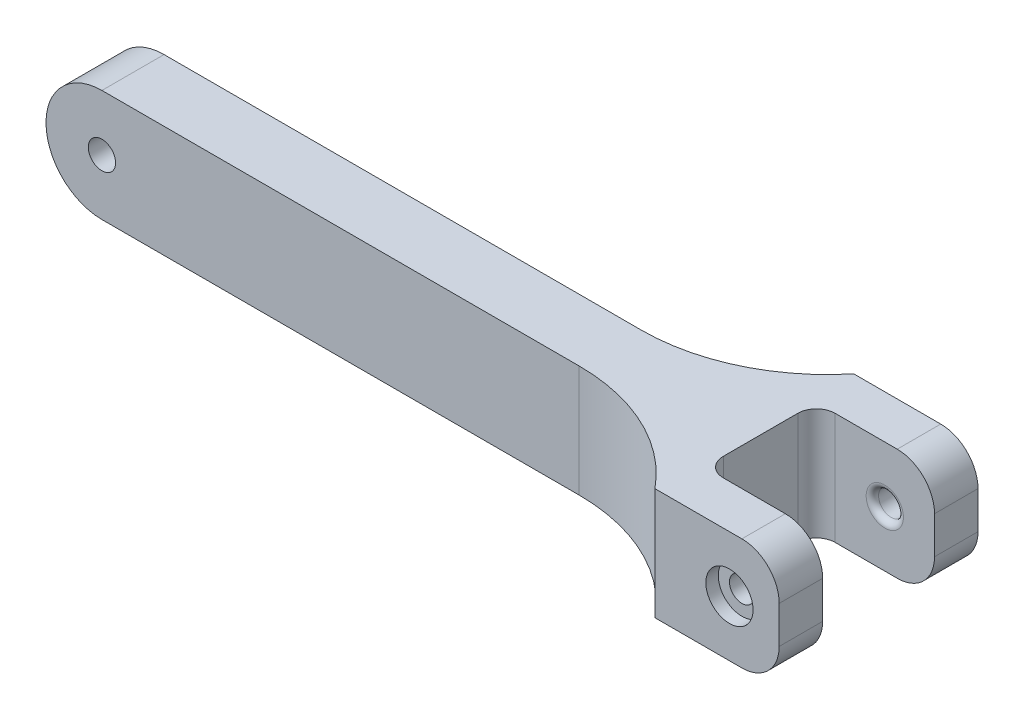
ISO-10303-21;
HEADER;
FILE_DESCRIPTION(('STEP AP214'),'2;1');
FILE_NAME('part.step','',(''),(''),'','','');
FILE_SCHEMA(('AUTOMOTIVE_DESIGN { 1 0 10303 214 1 1 1 1 }'));
ENDSEC;
DATA;
#1=APPLICATION_CONTEXT('core data for automotive mechanical design processes');
#2=APPLICATION_PROTOCOL_DEFINITION('international standard','automotive_design',2000,#1);
#3=PRODUCT_CONTEXT('',#1,'mechanical');
#4=PRODUCT('Part','Part','',(#3));
#5=PRODUCT_RELATED_PRODUCT_CATEGORY('part','',(#4));
#6=PRODUCT_DEFINITION_FORMATION('','',#4);
#7=PRODUCT_DEFINITION_CONTEXT('part definition',#1,'design');
#8=PRODUCT_DEFINITION('design','',#6,#7);
#9=PRODUCT_DEFINITION_SHAPE('','',#8);
#10=(LENGTH_UNIT() NAMED_UNIT(*) SI_UNIT(.MILLI.,.METRE.));
#11=(NAMED_UNIT(*) PLANE_ANGLE_UNIT() SI_UNIT($,.RADIAN.));
#12=(NAMED_UNIT(*) SI_UNIT($,.STERADIAN.) SOLID_ANGLE_UNIT());
#13=UNCERTAINTY_MEASURE_WITH_UNIT(LENGTH_MEASURE(1.E-05),#10,'distance_accuracy_value','');
#14=(GEOMETRIC_REPRESENTATION_CONTEXT(3) GLOBAL_UNCERTAINTY_ASSIGNED_CONTEXT((#13)) GLOBAL_UNIT_ASSIGNED_CONTEXT((#10,
#11,#12)) REPRESENTATION_CONTEXT('',''));
#15=CARTESIAN_POINT('',(0.,0.,0.));
#16=DIRECTION('',(0.,0.,1.));
#17=DIRECTION('',(1.,0.,0.));
#18=AXIS2_PLACEMENT_3D('',#15,#16,#17);
#19=CARTESIAN_POINT('',(56.,0.,-5.5));
#20=DIRECTION('',(0.,0.,1.));
#21=DIRECTION('',(1.,0.,0.));
#22=AXIS2_PLACEMENT_3D('',#19,#20,#21);
#23=CYLINDRICAL_SURFACE('',#22,0.999999999999998);
#24=CARTESIAN_POINT('',(56.,0.,7.));
#25=DIRECTION('',(0.,0.,1.));
#26=DIRECTION('',(1.,0.,0.));
#27=AXIS2_PLACEMENT_3D('',#24,#25,#26);
#28=CIRCLE('',#27,0.999999999999998);
#29=CARTESIAN_POINT('',(57.,0.,7.));
#30=VERTEX_POINT('',#29);
#31=EDGE_CURVE('E345',#30,#30,#28,.T.);
#32=ORIENTED_EDGE('',*,*,#31,.F.);
#33=EDGE_LOOP('',(#32));
#34=FACE_BOUND('',#33,.T.);
#35=CARTESIAN_POINT('',(56.,0.,9.5));
#36=DIRECTION('',(0.,0.,1.));
#37=DIRECTION('',(1.,0.,0.));
#38=AXIS2_PLACEMENT_3D('',#35,#36,#37);
#39=CIRCLE('',#38,0.999999999999998);
#40=CARTESIAN_POINT('',(57.,0.,9.5));
#41=VERTEX_POINT('',#40);
#42=EDGE_CURVE('E283',#41,#41,#39,.F.);
#43=ORIENTED_EDGE('',*,*,#42,.F.);
#44=EDGE_LOOP('',(#43));
#45=FACE_BOUND('',#44,.T.);
#46=ADVANCED_FACE('F37',(#34,#45),#23,.F.);
#47=CARTESIAN_POINT('',(0.,-4.5,5.));
#48=DIRECTION('',(0.,1.,0.));
#49=DIRECTION('',(0.,0.,1.));
#50=AXIS2_PLACEMENT_3D('',#47,#48,#49);
#51=PLANE('',#50);
#52=DIRECTION('',(0.,0.,1.));
#53=VECTOR('',#52,1.);
#54=CARTESIAN_POINT('',(50.5,-4.5,0.));
#55=LINE('',#54,#53);
#56=CARTESIAN_POINT('',(50.5,-4.5,-0.499999999999999));
#57=VERTEX_POINT('',#56);
#58=CARTESIAN_POINT('',(50.5,-4.5,5.5));
#59=VERTEX_POINT('',#58);
#60=EDGE_CURVE('E356',#57,#59,#55,.T.);
#61=ORIENTED_EDGE('',*,*,#60,.T.);
#62=CARTESIAN_POINT('',(52.,-4.5,5.5));
#63=DIRECTION('',(0.,1.,0.));
#64=DIRECTION('',(0.,0.,1.));
#65=AXIS2_PLACEMENT_3D('',#62,#63,#64);
#66=CIRCLE('',#65,1.5);
#67=CARTESIAN_POINT('',(52.,-4.5,7.));
#68=VERTEX_POINT('',#67);
#69=EDGE_CURVE('E52',#59,#68,#66,.T.);
#70=ORIENTED_EDGE('',*,*,#69,.T.);
#71=DIRECTION('',(1.,0.,0.));
#72=VECTOR('',#71,1.);
#73=CARTESIAN_POINT('',(0.,-4.5,7.));
#74=LINE('',#73,#72);
#75=CARTESIAN_POINT('',(57.,-4.5,7.));
#76=VERTEX_POINT('',#75);
#77=EDGE_CURVE('E354',#68,#76,#74,.T.);
#78=ORIENTED_EDGE('',*,*,#77,.T.);
#79=DIRECTION('',(0.,0.,1.));
#80=VECTOR('',#79,1.);
#81=CARTESIAN_POINT('',(57.,-4.5,5.));
#82=LINE('',#81,#80);
#83=CARTESIAN_POINT('',(57.,-4.5,10.5));
#84=VERTEX_POINT('',#83);
#85=EDGE_CURVE('E267',#76,#84,#82,.T.);
#86=ORIENTED_EDGE('',*,*,#85,.T.);
#87=DIRECTION('',(1.,0.,0.));
#88=VECTOR('',#87,1.);
#89=CARTESIAN_POINT('',(0.,-4.5,10.5));
#90=LINE('',#89,#88);
#91=CARTESIAN_POINT('',(50.,-4.5,10.5));
#92=VERTEX_POINT('',#91);
#93=EDGE_CURVE('E187',#92,#84,#90,.T.);
#94=ORIENTED_EDGE('',*,*,#93,.F.);
#95=CARTESIAN_POINT('',(38.3918132337561,-4.5,20.));
#96=DIRECTION('',(0.,1.,0.));
#97=DIRECTION('',(0.,0.,1.));
#98=AXIS2_PLACEMENT_3D('',#95,#96,#97);
#99=CIRCLE('',#98,15.);
#100=CARTESIAN_POINT('',(38.3918132337561,-4.5,5.));
#101=VERTEX_POINT('',#100);
#102=EDGE_CURVE('E242',#92,#101,#99,.T.);
#103=ORIENTED_EDGE('',*,*,#102,.T.);
#104=DIRECTION('',(1.,0.,0.));
#105=VECTOR('',#104,1.);
#106=CARTESIAN_POINT('',(0.,-4.5,5.));
#107=LINE('',#106,#105);
#108=CARTESIAN_POINT('',(0.,-4.5,5.));
#109=VERTEX_POINT('',#108);
#110=EDGE_CURVE('E218',#109,#101,#107,.T.);
#111=ORIENTED_EDGE('',*,*,#110,.F.);
#112=DIRECTION('',(0.,0.,-1.));
#113=VECTOR('',#112,1.);
#114=CARTESIAN_POINT('',(0.,-4.5,5.));
#115=LINE('',#114,#113);
#116=CARTESIAN_POINT('',(0.,-4.5,0.));
#117=VERTEX_POINT('',#116);
#118=EDGE_CURVE('E211',#109,#117,#115,.T.);
#119=ORIENTED_EDGE('',*,*,#118,.T.);
#120=DIRECTION('',(1.,0.,0.));
#121=VECTOR('',#120,1.);
#122=CARTESIAN_POINT('',(0.,-4.5,0.));
#123=LINE('',#122,#121);
#124=CARTESIAN_POINT('',(38.3918132337561,-4.5,0.));
#125=VERTEX_POINT('',#124);
#126=EDGE_CURVE('E171',#117,#125,#123,.T.);
#127=ORIENTED_EDGE('',*,*,#126,.T.);
#128=CARTESIAN_POINT('',(38.3918132337561,-4.5,-15.));
#129=DIRECTION('',(0.,1.,0.));
#130=DIRECTION('',(0.,0.,1.));
#131=AXIS2_PLACEMENT_3D('',#128,#129,#130);
#132=CIRCLE('',#131,15.);
#133=CARTESIAN_POINT('',(50.,-4.5,-5.5));
#134=VERTEX_POINT('',#133);
#135=EDGE_CURVE('E163',#125,#134,#132,.T.);
#136=ORIENTED_EDGE('',*,*,#135,.T.);
#137=DIRECTION('',(1.,0.,0.));
#138=VECTOR('',#137,1.);
#139=CARTESIAN_POINT('',(0.,-4.5,-5.5));
#140=LINE('',#139,#138);
#141=CARTESIAN_POINT('',(57.,-4.5,-5.5));
#142=VERTEX_POINT('',#141);
#143=EDGE_CURVE('E167',#134,#142,#140,.T.);
#144=ORIENTED_EDGE('',*,*,#143,.T.);
#145=DIRECTION('',(0.,0.,1.));
#146=VECTOR('',#145,1.);
#147=CARTESIAN_POINT('',(57.,-4.5,5.));
#148=LINE('',#147,#146);
#149=CARTESIAN_POINT('',(57.,-4.5,-2.));
#150=VERTEX_POINT('',#149);
#151=EDGE_CURVE('E265',#142,#150,#148,.T.);
#152=ORIENTED_EDGE('',*,*,#151,.T.);
#153=DIRECTION('',(-1.,0.,0.));
#154=VECTOR('',#153,1.);
#155=CARTESIAN_POINT('',(0.,-4.5,-1.99999999999999));
#156=LINE('',#155,#154);
#157=CARTESIAN_POINT('',(52.,-4.5,-2.));
#158=VERTEX_POINT('',#157);
#159=EDGE_CURVE('E188',#150,#158,#156,.T.);
#160=ORIENTED_EDGE('',*,*,#159,.T.);
#161=CARTESIAN_POINT('',(52.,-4.5,-0.499999999999999));
#162=DIRECTION('',(0.,1.,0.));
#163=DIRECTION('',(0.,0.,1.));
#164=AXIS2_PLACEMENT_3D('',#161,#162,#163);
#165=CIRCLE('',#164,1.5);
#166=EDGE_CURVE('E298',#158,#57,#165,.T.);
#167=ORIENTED_EDGE('',*,*,#166,.T.);
#168=EDGE_LOOP('',(#61,#70,#78,#86,#94,#103,#111,#119,#127,#136,#144,#152,#160,#167));
#169=FACE_BOUND('',#168,.T.);
#170=ADVANCED_FACE('F165',(#169),#51,.F.);
#171=CARTESIAN_POINT('',(0.,4.5,5.));
#172=DIRECTION('',(0.,1.,0.));
#173=DIRECTION('',(0.,0.,1.));
#174=AXIS2_PLACEMENT_3D('',#171,#172,#173);
#175=PLANE('',#174);
#176=DIRECTION('',(1.,0.,0.));
#177=VECTOR('',#176,1.);
#178=CARTESIAN_POINT('',(0.,4.5,10.5));
#179=LINE('',#178,#177);
#180=CARTESIAN_POINT('',(50.,4.5,10.5));
#181=VERTEX_POINT('',#180);
#182=CARTESIAN_POINT('',(57.,4.5,10.5));
#183=VERTEX_POINT('',#182);
#184=EDGE_CURVE('E357',#181,#183,#179,.T.);
#185=ORIENTED_EDGE('',*,*,#184,.T.);
#186=DIRECTION('',(0.,0.,1.));
#187=VECTOR('',#186,1.);
#188=CARTESIAN_POINT('',(57.,4.5,7.));
#189=LINE('',#188,#187);
#190=CARTESIAN_POINT('',(57.,4.5,7.));
#191=VERTEX_POINT('',#190);
#192=EDGE_CURVE('E257',#183,#191,#189,.F.);
#193=ORIENTED_EDGE('',*,*,#192,.T.);
#194=DIRECTION('',(1.,0.,0.));
#195=VECTOR('',#194,1.);
#196=CARTESIAN_POINT('',(0.,4.5,7.));
#197=LINE('',#196,#195);
#198=CARTESIAN_POINT('',(52.,4.5,7.));
#199=VERTEX_POINT('',#198);
#200=EDGE_CURVE('E348',#199,#191,#197,.T.);
#201=ORIENTED_EDGE('',*,*,#200,.F.);
#202=CARTESIAN_POINT('',(52.,4.5,5.5));
#203=DIRECTION('',(0.,1.,0.));
#204=DIRECTION('',(0.,0.,1.));
#205=AXIS2_PLACEMENT_3D('',#202,#203,#204);
#206=CIRCLE('',#205,1.5);
#207=CARTESIAN_POINT('',(50.5,4.5,5.5));
#208=VERTEX_POINT('',#207);
#209=EDGE_CURVE('E60',#199,#208,#206,.F.);
#210=ORIENTED_EDGE('',*,*,#209,.T.);
#211=DIRECTION('',(0.,0.,1.));
#212=VECTOR('',#211,1.);
#213=CARTESIAN_POINT('',(50.5,4.5,0.));
#214=LINE('',#213,#212);
#215=CARTESIAN_POINT('',(50.5,4.5,-0.499999999999999));
#216=VERTEX_POINT('',#215);
#217=EDGE_CURVE('E364',#216,#208,#214,.T.);
#218=ORIENTED_EDGE('',*,*,#217,.F.);
#219=CARTESIAN_POINT('',(52.,4.5,-0.499999999999999));
#220=DIRECTION('',(0.,1.,0.));
#221=DIRECTION('',(0.,0.,1.));
#222=AXIS2_PLACEMENT_3D('',#219,#220,#221);
#223=CIRCLE('',#222,1.5);
#224=CARTESIAN_POINT('',(52.,4.5,-2.));
#225=VERTEX_POINT('',#224);
#226=EDGE_CURVE('E296',#216,#225,#223,.F.);
#227=ORIENTED_EDGE('',*,*,#226,.T.);
#228=DIRECTION('',(-1.,0.,0.));
#229=VECTOR('',#228,1.);
#230=CARTESIAN_POINT('',(0.,4.5,-1.99999999999999));
#231=LINE('',#230,#229);
#232=CARTESIAN_POINT('',(57.,4.5,-2.));
#233=VERTEX_POINT('',#232);
#234=EDGE_CURVE('E367',#233,#225,#231,.T.);
#235=ORIENTED_EDGE('',*,*,#234,.F.);
#236=DIRECTION('',(0.,0.,1.));
#237=VECTOR('',#236,1.);
#238=CARTESIAN_POINT('',(57.,4.5,-5.5));
#239=LINE('',#238,#237);
#240=CARTESIAN_POINT('',(57.,4.5,-5.5));
#241=VERTEX_POINT('',#240);
#242=EDGE_CURVE('E255',#233,#241,#239,.F.);
#243=ORIENTED_EDGE('',*,*,#242,.T.);
#244=DIRECTION('',(1.,0.,0.));
#245=VECTOR('',#244,1.);
#246=CARTESIAN_POINT('',(0.,4.5,-5.5));
#247=LINE('',#246,#245);
#248=CARTESIAN_POINT('',(50.,4.5,-5.5));
#249=VERTEX_POINT('',#248);
#250=EDGE_CURVE('E370',#249,#241,#247,.T.);
#251=ORIENTED_EDGE('',*,*,#250,.F.);
#252=CARTESIAN_POINT('',(38.3918132337561,4.5,-15.));
#253=DIRECTION('',(0.,1.,0.));
#254=DIRECTION('',(0.,0.,1.));
#255=AXIS2_PLACEMENT_3D('',#252,#253,#254);
#256=CIRCLE('',#255,15.);
#257=CARTESIAN_POINT('',(38.3918132337561,4.5,0.));
#258=VERTEX_POINT('',#257);
#259=EDGE_CURVE('E176',#249,#258,#256,.F.);
#260=ORIENTED_EDGE('',*,*,#259,.T.);
#261=DIRECTION('',(1.,0.,0.));
#262=VECTOR('',#261,1.);
#263=CARTESIAN_POINT('',(0.,4.5,0.));
#264=LINE('',#263,#262);
#265=CARTESIAN_POINT('',(0.,4.5,0.));
#266=VERTEX_POINT('',#265);
#267=EDGE_CURVE('E215',#266,#258,#264,.T.);
#268=ORIENTED_EDGE('',*,*,#267,.F.);
#269=DIRECTION('',(0.,0.,-1.));
#270=VECTOR('',#269,1.);
#271=CARTESIAN_POINT('',(0.,4.5,5.));
#272=LINE('',#271,#270);
#273=CARTESIAN_POINT('',(0.,4.5,5.));
#274=VERTEX_POINT('',#273);
#275=EDGE_CURVE('E220',#274,#266,#272,.T.);
#276=ORIENTED_EDGE('',*,*,#275,.F.);
#277=DIRECTION('',(1.,0.,0.));
#278=VECTOR('',#277,1.);
#279=CARTESIAN_POINT('',(0.,4.5,5.));
#280=LINE('',#279,#278);
#281=CARTESIAN_POINT('',(38.3918132337561,4.5,5.));
#282=VERTEX_POINT('',#281);
#283=EDGE_CURVE('E208',#274,#282,#280,.T.);
#284=ORIENTED_EDGE('',*,*,#283,.T.);
#285=CARTESIAN_POINT('',(38.3918132337561,4.5,20.));
#286=DIRECTION('',(0.,1.,0.));
#287=DIRECTION('',(0.,0.,1.));
#288=AXIS2_PLACEMENT_3D('',#285,#286,#287);
#289=CIRCLE('',#288,15.);
#290=EDGE_CURVE('E244',#282,#181,#289,.F.);
#291=ORIENTED_EDGE('',*,*,#290,.T.);
#292=EDGE_LOOP('',(#185,#193,#201,#210,#218,#227,#235,#243,#251,#260,#268,#276,#284,#291));
#293=FACE_BOUND('',#292,.T.);
#294=ADVANCED_FACE('F322',(#293),#175,.T.);
#295=CARTESIAN_POINT('',(0.,0.,5.));
#296=DIRECTION('',(0.,0.,-1.));
#297=DIRECTION('',(-1.,0.,0.));
#298=AXIS2_PLACEMENT_3D('',#295,#296,#297);
#299=CYLINDRICAL_SURFACE('',#298,4.5);
#300=CARTESIAN_POINT('',(0.,0.,0.));
#301=DIRECTION('',(0.,0.,1.));
#302=DIRECTION('',(1.,0.,0.));
#303=AXIS2_PLACEMENT_3D('',#300,#301,#302);
#304=CIRCLE('',#303,4.5);
#305=EDGE_CURVE('E212',#266,#117,#304,.T.);
#306=ORIENTED_EDGE('',*,*,#305,.T.);
#307=ORIENTED_EDGE('',*,*,#118,.F.);
#308=CARTESIAN_POINT('',(0.,0.,5.));
#309=DIRECTION('',(0.,0.,1.));
#310=DIRECTION('',(1.,0.,0.));
#311=AXIS2_PLACEMENT_3D('',#308,#309,#310);
#312=CIRCLE('',#311,4.5);
#313=EDGE_CURVE('E205',#274,#109,#312,.T.);
#314=ORIENTED_EDGE('',*,*,#313,.F.);
#315=ORIENTED_EDGE('',*,*,#275,.T.);
#316=EDGE_LOOP('',(#306,#307,#314,#315));
#317=FACE_BOUND('',#316,.T.);
#318=ADVANCED_FACE('F406',(#317),#299,.T.);
#319=CARTESIAN_POINT('',(0.,0.,5.));
#320=DIRECTION('',(0.,0.,-1.));
#321=DIRECTION('',(-1.,0.,0.));
#322=AXIS2_PLACEMENT_3D('',#319,#320,#321);
#323=CYLINDRICAL_SURFACE('',#322,1.1);
#324=CARTESIAN_POINT('',(0.,0.,5.));
#325=DIRECTION('',(0.,0.,1.));
#326=DIRECTION('',(1.,0.,0.));
#327=AXIS2_PLACEMENT_3D('',#324,#325,#326);
#328=CIRCLE('',#327,1.1);
#329=CARTESIAN_POINT('',(1.1,0.,5.));
#330=VERTEX_POINT('',#329);
#331=EDGE_CURVE('E207',#330,#330,#328,.T.);
#332=ORIENTED_EDGE('',*,*,#331,.T.);
#333=EDGE_LOOP('',(#332));
#334=FACE_BOUND('',#333,.T.);
#335=CARTESIAN_POINT('',(0.,0.,0.));
#336=DIRECTION('',(0.,0.,1.));
#337=DIRECTION('',(1.,0.,0.));
#338=AXIS2_PLACEMENT_3D('',#335,#336,#337);
#339=CIRCLE('',#338,1.1);
#340=CARTESIAN_POINT('',(1.1,0.,0.));
#341=VERTEX_POINT('',#340);
#342=EDGE_CURVE('E214',#341,#341,#339,.T.);
#343=ORIENTED_EDGE('',*,*,#342,.F.);
#344=EDGE_LOOP('',(#343));
#345=FACE_BOUND('',#344,.T.);
#346=ADVANCED_FACE('F448',(#334,#345),#323,.F.);
#347=CARTESIAN_POINT('',(0.,0.,5.));
#348=DIRECTION('',(0.,0.,1.));
#349=DIRECTION('',(1.,0.,0.));
#350=AXIS2_PLACEMENT_3D('',#347,#348,#349);
#351=PLANE('',#350);
#352=ORIENTED_EDGE('',*,*,#110,.T.);
#353=DIRECTION('',(0.,-1.,0.));
#354=VECTOR('',#353,1.);
#355=CARTESIAN_POINT('',(38.3918132337561,4.5,5.));
#356=LINE('',#355,#354);
#357=EDGE_CURVE('E177',#101,#282,#356,.F.);
#358=ORIENTED_EDGE('',*,*,#357,.T.);
#359=ORIENTED_EDGE('',*,*,#283,.F.);
#360=ORIENTED_EDGE('',*,*,#313,.T.);
#361=EDGE_LOOP('',(#352,#358,#359,#360));
#362=FACE_BOUND('',#361,.T.);
#363=ORIENTED_EDGE('',*,*,#331,.F.);
#364=EDGE_LOOP('',(#363));
#365=FACE_BOUND('',#364,.T.);
#366=ADVANCED_FACE('F400',(#362,#365),#351,.T.);
#367=CARTESIAN_POINT('',(0.,0.,0.));
#368=DIRECTION('',(0.,0.,1.));
#369=DIRECTION('',(1.,0.,0.));
#370=AXIS2_PLACEMENT_3D('',#367,#368,#369);
#371=PLANE('',#370);
#372=ORIENTED_EDGE('',*,*,#267,.T.);
#373=DIRECTION('',(0.,1.,0.));
#374=VECTOR('',#373,1.);
#375=CARTESIAN_POINT('',(38.3918132337561,0.,0.));
#376=LINE('',#375,#374);
#377=EDGE_CURVE('E222',#258,#125,#376,.F.);
#378=ORIENTED_EDGE('',*,*,#377,.T.);
#379=ORIENTED_EDGE('',*,*,#126,.F.);
#380=ORIENTED_EDGE('',*,*,#305,.F.);
#381=EDGE_LOOP('',(#372,#378,#379,#380));
#382=FACE_BOUND('',#381,.T.);
#383=ORIENTED_EDGE('',*,*,#342,.T.);
#384=EDGE_LOOP('',(#383));
#385=FACE_BOUND('',#384,.T.);
#386=ADVANCED_FACE('F409',(#382,#385),#371,.F.);
#387=CARTESIAN_POINT('',(0.,-4.5,7.));
#388=DIRECTION('',(0.,0.,1.));
#389=DIRECTION('',(1.,0.,0.));
#390=AXIS2_PLACEMENT_3D('',#387,#388,#389);
#391=PLANE('',#390);
#392=ORIENTED_EDGE('',*,*,#31,.T.);
#393=EDGE_LOOP('',(#392));
#394=FACE_BOUND('',#393,.T.);
#395=ORIENTED_EDGE('',*,*,#77,.F.);
#396=DIRECTION('',(0.,1.,0.));
#397=VECTOR('',#396,1.);
#398=CARTESIAN_POINT('',(52.,4.5,7.));
#399=LINE('',#398,#397);
#400=EDGE_CURVE('E294',#68,#199,#399,.T.);
#401=ORIENTED_EDGE('',*,*,#400,.T.);
#402=ORIENTED_EDGE('',*,*,#200,.T.);
#403=CARTESIAN_POINT('',(57.,1.5,7.));
#404=DIRECTION('',(0.,0.,1.));
#405=DIRECTION('',(1.,0.,0.));
#406=AXIS2_PLACEMENT_3D('',#403,#404,#405);
#407=CIRCLE('',#406,3.);
#408=CARTESIAN_POINT('',(60.,1.5,7.));
#409=VERTEX_POINT('',#408);
#410=EDGE_CURVE('E263',#191,#409,#407,.F.);
#411=ORIENTED_EDGE('',*,*,#410,.T.);
#412=DIRECTION('',(0.,1.,0.));
#413=VECTOR('',#412,1.);
#414=CARTESIAN_POINT('',(60.,-4.5,7.));
#415=LINE('',#414,#413);
#416=CARTESIAN_POINT('',(60.,-1.5,7.));
#417=VERTEX_POINT('',#416);
#418=EDGE_CURVE('E236',#417,#409,#415,.T.);
#419=ORIENTED_EDGE('',*,*,#418,.F.);
#420=CARTESIAN_POINT('',(57.,-1.5,7.));
#421=DIRECTION('',(0.,0.,1.));
#422=DIRECTION('',(1.,0.,0.));
#423=AXIS2_PLACEMENT_3D('',#420,#421,#422);
#424=CIRCLE('',#423,3.);
#425=EDGE_CURVE('E260',#417,#76,#424,.F.);
#426=ORIENTED_EDGE('',*,*,#425,.T.);
#427=EDGE_LOOP('',(#395,#401,#402,#411,#419,#426));
#428=FACE_BOUND('',#427,.T.);
#429=ADVANCED_FACE('F389',(#394,#428),#391,.F.);
#430=CARTESIAN_POINT('',(60.,-4.5,0.));
#431=DIRECTION('',(-1.,0.,0.));
#432=DIRECTION('',(0.,0.,1.));
#433=AXIS2_PLACEMENT_3D('',#430,#431,#432);
#434=PLANE('',#433);
#435=ORIENTED_EDGE('',*,*,#418,.T.);
#436=DIRECTION('',(0.,0.,1.));
#437=VECTOR('',#436,1.);
#438=CARTESIAN_POINT('',(60.,1.5,10.5));
#439=LINE('',#438,#437);
#440=CARTESIAN_POINT('',(60.,1.5,10.5));
#441=VERTEX_POINT('',#440);
#442=EDGE_CURVE('E248',#409,#441,#439,.T.);
#443=ORIENTED_EDGE('',*,*,#442,.T.);
#444=DIRECTION('',(0.,1.,0.));
#445=VECTOR('',#444,1.);
#446=CARTESIAN_POINT('',(60.,-4.5,10.5));
#447=LINE('',#446,#445);
#448=CARTESIAN_POINT('',(60.,-1.5,10.5));
#449=VERTEX_POINT('',#448);
#450=EDGE_CURVE('E196',#449,#441,#447,.T.);
#451=ORIENTED_EDGE('',*,*,#450,.F.);
#452=DIRECTION('',(0.,0.,1.));
#453=VECTOR('',#452,1.);
#454=CARTESIAN_POINT('',(60.,-1.5,0.));
#455=LINE('',#454,#453);
#456=EDGE_CURVE('E246',#449,#417,#455,.F.);
#457=ORIENTED_EDGE('',*,*,#456,.T.);
#458=EDGE_LOOP('',(#435,#443,#451,#457));
#459=FACE_BOUND('',#458,.T.);
#460=ADVANCED_FACE('F382',(#459),#434,.F.);
#461=CARTESIAN_POINT('',(0.,-4.5,10.5));
#462=DIRECTION('',(0.,0.,1.));
#463=DIRECTION('',(1.,0.,0.));
#464=AXIS2_PLACEMENT_3D('',#461,#462,#463);
#465=PLANE('',#464);
#466=CARTESIAN_POINT('',(56.,0.,10.5));
#467=DIRECTION('',(0.,0.,1.));
#468=DIRECTION('',(1.,0.,0.));
#469=AXIS2_PLACEMENT_3D('',#466,#467,#468);
#470=CIRCLE('',#469,1.9);
#471=CARTESIAN_POINT('',(57.9,0.,10.5));
#472=VERTEX_POINT('',#471);
#473=EDGE_CURVE('E351',#472,#472,#470,.T.);
#474=ORIENTED_EDGE('',*,*,#473,.F.);
#475=EDGE_LOOP('',(#474));
#476=FACE_BOUND('',#475,.T.);
#477=ORIENTED_EDGE('',*,*,#450,.T.);
#478=CARTESIAN_POINT('',(57.,1.5,10.5));
#479=DIRECTION('',(0.,0.,1.));
#480=DIRECTION('',(1.,0.,0.));
#481=AXIS2_PLACEMENT_3D('',#478,#479,#480);
#482=CIRCLE('',#481,3.);
#483=EDGE_CURVE('E253',#441,#183,#482,.T.);
#484=ORIENTED_EDGE('',*,*,#483,.T.);
#485=ORIENTED_EDGE('',*,*,#184,.F.);
#486=DIRECTION('',(0.,1.,0.));
#487=VECTOR('',#486,1.);
#488=CARTESIAN_POINT('',(50.,-4.5,10.5));
#489=LINE('',#488,#487);
#490=EDGE_CURVE('E192',#92,#181,#489,.T.);
#491=ORIENTED_EDGE('',*,*,#490,.F.);
#492=ORIENTED_EDGE('',*,*,#93,.T.);
#493=CARTESIAN_POINT('',(57.,-1.5,10.5));
#494=DIRECTION('',(0.,0.,1.));
#495=DIRECTION('',(1.,0.,0.));
#496=AXIS2_PLACEMENT_3D('',#493,#494,#495);
#497=CIRCLE('',#496,3.);
#498=EDGE_CURVE('E251',#84,#449,#497,.T.);
#499=ORIENTED_EDGE('',*,*,#498,.T.);
#500=EDGE_LOOP('',(#477,#484,#485,#491,#492,#499));
#501=FACE_BOUND('',#500,.T.);
#502=ADVANCED_FACE('F378',(#476,#501),#465,.T.);
#503=CARTESIAN_POINT('',(0.,-4.5,-5.5));
#504=DIRECTION('',(0.,0.,1.));
#505=DIRECTION('',(1.,0.,0.));
#506=AXIS2_PLACEMENT_3D('',#503,#504,#505);
#507=PLANE('',#506);
#508=CARTESIAN_POINT('',(56.,0.,-5.5));
#509=DIRECTION('',(0.,0.,1.));
#510=DIRECTION('',(1.,0.,0.));
#511=AXIS2_PLACEMENT_3D('',#508,#509,#510);
#512=CIRCLE('',#511,0.999999999999998);
#513=CARTESIAN_POINT('',(57.,0.,-5.5));
#514=VERTEX_POINT('',#513);
#515=EDGE_CURVE('E286',#514,#514,#512,.T.);
#516=ORIENTED_EDGE('',*,*,#515,.T.);
#517=EDGE_LOOP('',(#516));
#518=FACE_BOUND('',#517,.T.);
#519=DIRECTION('',(0.,1.,0.));
#520=VECTOR('',#519,1.);
#521=CARTESIAN_POINT('',(60.,-4.5,-5.5));
#522=LINE('',#521,#520);
#523=CARTESIAN_POINT('',(60.,-1.5,-5.5));
#524=VERTEX_POINT('',#523);
#525=CARTESIAN_POINT('',(60.,1.5,-5.5));
#526=VERTEX_POINT('',#525);
#527=EDGE_CURVE('E193',#524,#526,#522,.T.);
#528=ORIENTED_EDGE('',*,*,#527,.F.);
#529=CARTESIAN_POINT('',(57.,-1.5,-5.5));
#530=DIRECTION('',(0.,0.,1.));
#531=DIRECTION('',(1.,0.,0.));
#532=AXIS2_PLACEMENT_3D('',#529,#530,#531);
#533=CIRCLE('',#532,3.);
#534=EDGE_CURVE('E186',#524,#142,#533,.F.);
#535=ORIENTED_EDGE('',*,*,#534,.T.);
#536=ORIENTED_EDGE('',*,*,#143,.F.);
#537=DIRECTION('',(0.,1.,0.));
#538=VECTOR('',#537,1.);
#539=CARTESIAN_POINT('',(50.,-4.5,-5.5));
#540=LINE('',#539,#538);
#541=EDGE_CURVE('E183',#134,#249,#540,.T.);
#542=ORIENTED_EDGE('',*,*,#541,.T.);
#543=ORIENTED_EDGE('',*,*,#250,.T.);
#544=CARTESIAN_POINT('',(57.,1.5,-5.5));
#545=DIRECTION('',(0.,0.,1.));
#546=DIRECTION('',(1.,0.,0.));
#547=AXIS2_PLACEMENT_3D('',#544,#545,#546);
#548=CIRCLE('',#547,3.);
#549=EDGE_CURVE('E279',#241,#526,#548,.F.);
#550=ORIENTED_EDGE('',*,*,#549,.T.);
#551=EDGE_LOOP('',(#528,#535,#536,#542,#543,#550));
#552=FACE_BOUND('',#551,.T.);
#553=ADVANCED_FACE('F181',(#518,#552),#507,.F.);
#554=DIRECTION('',(0.,1.,0.));
#555=VECTOR('',#554,1.);
#556=CARTESIAN_POINT('',(60.,-4.5,-2.));
#557=LINE('',#556,#555);
#558=CARTESIAN_POINT('',(60.,-1.5,-2.));
#559=VERTEX_POINT('',#558);
#560=CARTESIAN_POINT('',(60.,1.5,-2.));
#561=VERTEX_POINT('',#560);
#562=EDGE_CURVE('E199',#559,#561,#557,.T.);
#563=ORIENTED_EDGE('',*,*,#562,.F.);
#564=DIRECTION('',(0.,0.,1.));
#565=VECTOR('',#564,1.);
#566=CARTESIAN_POINT('',(60.,-1.5,0.));
#567=LINE('',#566,#565);
#568=EDGE_CURVE('E277',#559,#524,#567,.F.);
#569=ORIENTED_EDGE('',*,*,#568,.T.);
#570=ORIENTED_EDGE('',*,*,#527,.T.);
#571=DIRECTION('',(0.,0.,1.));
#572=VECTOR('',#571,1.);
#573=CARTESIAN_POINT('',(60.,1.5,-2.));
#574=LINE('',#573,#572);
#575=EDGE_CURVE('E274',#526,#561,#574,.T.);
#576=ORIENTED_EDGE('',*,*,#575,.T.);
#577=EDGE_LOOP('',(#563,#569,#570,#576));
#578=FACE_BOUND('',#577,.T.);
#579=ADVANCED_FACE('F420',(#578),#434,.F.);
#580=CARTESIAN_POINT('',(0.,-4.5,-1.99999999999999));
#581=DIRECTION('',(0.,0.,-1.));
#582=DIRECTION('',(-1.,0.,0.));
#583=AXIS2_PLACEMENT_3D('',#580,#581,#582);
#584=PLANE('',#583);
#585=CARTESIAN_POINT('',(56.,0.,-2.));
#586=DIRECTION('',(0.,0.,-1.));
#587=DIRECTION('',(-1.,0.,0.));
#588=AXIS2_PLACEMENT_3D('',#585,#586,#587);
#589=CIRCLE('',#588,1.5);
#590=CARTESIAN_POINT('',(54.5,0.,-2.));
#591=VERTEX_POINT('',#590);
#592=EDGE_CURVE('E45',#591,#591,#589,.T.);
#593=ORIENTED_EDGE('',*,*,#592,.T.);
#594=EDGE_LOOP('',(#593));
#595=FACE_BOUND('',#594,.T.);
#596=ORIENTED_EDGE('',*,*,#234,.T.);
#597=DIRECTION('',(0.,1.,0.));
#598=VECTOR('',#597,1.);
#599=CARTESIAN_POINT('',(52.,-4.5,-2.));
#600=LINE('',#599,#598);
#601=EDGE_CURVE('E292',#225,#158,#600,.F.);
#602=ORIENTED_EDGE('',*,*,#601,.T.);
#603=ORIENTED_EDGE('',*,*,#159,.F.);
#604=CARTESIAN_POINT('',(57.,-1.5,-2.));
#605=DIRECTION('',(0.,0.,-1.));
#606=DIRECTION('',(-1.,0.,0.));
#607=AXIS2_PLACEMENT_3D('',#604,#605,#606);
#608=CIRCLE('',#607,3.);
#609=EDGE_CURVE('E272',#150,#559,#608,.F.);
#610=ORIENTED_EDGE('',*,*,#609,.T.);
#611=ORIENTED_EDGE('',*,*,#562,.T.);
#612=CARTESIAN_POINT('',(57.,1.5,-2.));
#613=DIRECTION('',(0.,0.,-1.));
#614=DIRECTION('',(-1.,0.,0.));
#615=AXIS2_PLACEMENT_3D('',#612,#613,#614);
#616=CIRCLE('',#615,3.);
#617=EDGE_CURVE('E270',#561,#233,#616,.F.);
#618=ORIENTED_EDGE('',*,*,#617,.T.);
#619=EDGE_LOOP('',(#596,#602,#603,#610,#611,#618));
#620=FACE_BOUND('',#619,.T.);
#621=ADVANCED_FACE('F304',(#595,#620),#584,.F.);
#622=CARTESIAN_POINT('',(50.5,-4.5,0.));
#623=DIRECTION('',(-1.,0.,0.));
#624=DIRECTION('',(0.,0.,1.));
#625=AXIS2_PLACEMENT_3D('',#622,#623,#624);
#626=PLANE('',#625);
#627=ORIENTED_EDGE('',*,*,#60,.F.);
#628=DIRECTION('',(0.,1.,0.));
#629=VECTOR('',#628,1.);
#630=CARTESIAN_POINT('',(50.5,4.5,-0.499999999999999));
#631=LINE('',#630,#629);
#632=EDGE_CURVE('E289',#57,#216,#631,.T.);
#633=ORIENTED_EDGE('',*,*,#632,.T.);
#634=ORIENTED_EDGE('',*,*,#217,.T.);
#635=DIRECTION('',(0.,1.,0.));
#636=VECTOR('',#635,1.);
#637=CARTESIAN_POINT('',(50.5,-4.5,5.5));
#638=LINE('',#637,#636);
#639=EDGE_CURVE('E282',#208,#59,#638,.F.);
#640=ORIENTED_EDGE('',*,*,#639,.T.);
#641=EDGE_LOOP('',(#627,#633,#634,#640));
#642=FACE_BOUND('',#641,.T.);
#643=ADVANCED_FACE('F432',(#642),#626,.F.);
#644=CARTESIAN_POINT('',(38.3918132337561,-4.5,-15.));
#645=DIRECTION('',(0.,1.,0.));
#646=DIRECTION('',(0.,0.,1.));
#647=AXIS2_PLACEMENT_3D('',#644,#645,#646);
#648=CYLINDRICAL_SURFACE('',#647,15.);
#649=ORIENTED_EDGE('',*,*,#259,.F.);
#650=ORIENTED_EDGE('',*,*,#541,.F.);
#651=ORIENTED_EDGE('',*,*,#135,.F.);
#652=ORIENTED_EDGE('',*,*,#377,.F.);
#653=EDGE_LOOP('',(#649,#650,#651,#652));
#654=FACE_BOUND('',#653,.T.);
#655=ADVANCED_FACE('F191',(#654),#648,.F.);
#656=CARTESIAN_POINT('',(38.3918132337561,-4.5,20.));
#657=DIRECTION('',(0.,1.,0.));
#658=DIRECTION('',(0.,0.,1.));
#659=AXIS2_PLACEMENT_3D('',#656,#657,#658);
#660=CYLINDRICAL_SURFACE('',#659,15.);
#661=ORIENTED_EDGE('',*,*,#290,.F.);
#662=ORIENTED_EDGE('',*,*,#357,.F.);
#663=ORIENTED_EDGE('',*,*,#102,.F.);
#664=ORIENTED_EDGE('',*,*,#490,.T.);
#665=EDGE_LOOP('',(#661,#662,#663,#664));
#666=FACE_BOUND('',#665,.T.);
#667=ADVANCED_FACE('F330',(#666),#660,.F.);
#668=CARTESIAN_POINT('',(56.,0.,-2.5));
#669=DIRECTION('',(0.,0.,-1.));
#670=DIRECTION('',(-1.,0.,0.));
#671=AXIS2_PLACEMENT_3D('',#668,#669,#670);
#672=CIRCLE('',#671,0.999999999999998);
#673=CARTESIAN_POINT('',(55.,0.,-2.5));
#674=VERTEX_POINT('',#673);
#675=EDGE_CURVE('E11',#674,#674,#672,.F.);
#676=ORIENTED_EDGE('',*,*,#675,.T.);
#677=EDGE_LOOP('',(#676));
#678=FACE_BOUND('',#677,.T.);
#679=ORIENTED_EDGE('',*,*,#515,.F.);
#680=EDGE_LOOP('',(#679));
#681=FACE_BOUND('',#680,.T.);
#682=ADVANCED_FACE('F318',(#678,#681),#23,.F.);
#683=CARTESIAN_POINT('',(57.,1.5,0.));
#684=DIRECTION('',(0.,0.,-1.));
#685=DIRECTION('',(-1.,0.,0.));
#686=AXIS2_PLACEMENT_3D('',#683,#684,#685);
#687=CYLINDRICAL_SURFACE('',#686,3.);
#688=ORIENTED_EDGE('',*,*,#410,.F.);
#689=ORIENTED_EDGE('',*,*,#192,.F.);
#690=ORIENTED_EDGE('',*,*,#483,.F.);
#691=ORIENTED_EDGE('',*,*,#442,.F.);
#692=EDGE_LOOP('',(#688,#689,#690,#691));
#693=FACE_BOUND('',#692,.T.);
#694=ADVANCED_FACE('F329',(#693),#687,.T.);
#695=CARTESIAN_POINT('',(57.,-1.5,5.));
#696=DIRECTION('',(0.,0.,1.));
#697=DIRECTION('',(1.,0.,0.));
#698=AXIS2_PLACEMENT_3D('',#695,#696,#697);
#699=CYLINDRICAL_SURFACE('',#698,3.);
#700=ORIENTED_EDGE('',*,*,#425,.F.);
#701=ORIENTED_EDGE('',*,*,#456,.F.);
#702=ORIENTED_EDGE('',*,*,#498,.F.);
#703=ORIENTED_EDGE('',*,*,#85,.F.);
#704=EDGE_LOOP('',(#700,#701,#702,#703));
#705=FACE_BOUND('',#704,.T.);
#706=ADVANCED_FACE('F336',(#705),#699,.T.);
#707=CARTESIAN_POINT('',(57.,-1.5,5.));
#708=DIRECTION('',(0.,0.,1.));
#709=DIRECTION('',(1.,0.,0.));
#710=AXIS2_PLACEMENT_3D('',#707,#708,#709);
#711=CYLINDRICAL_SURFACE('',#710,3.);
#712=ORIENTED_EDGE('',*,*,#534,.F.);
#713=ORIENTED_EDGE('',*,*,#568,.F.);
#714=ORIENTED_EDGE('',*,*,#609,.F.);
#715=ORIENTED_EDGE('',*,*,#151,.F.);
#716=EDGE_LOOP('',(#712,#713,#714,#715));
#717=FACE_BOUND('',#716,.T.);
#718=ADVANCED_FACE('F424',(#717),#711,.T.);
#719=CARTESIAN_POINT('',(57.,1.5,0.));
#720=DIRECTION('',(0.,0.,-1.));
#721=DIRECTION('',(-1.,0.,0.));
#722=AXIS2_PLACEMENT_3D('',#719,#720,#721);
#723=CYLINDRICAL_SURFACE('',#722,3.);
#724=ORIENTED_EDGE('',*,*,#549,.F.);
#725=ORIENTED_EDGE('',*,*,#242,.F.);
#726=ORIENTED_EDGE('',*,*,#617,.F.);
#727=ORIENTED_EDGE('',*,*,#575,.F.);
#728=EDGE_LOOP('',(#724,#725,#726,#727));
#729=FACE_BOUND('',#728,.T.);
#730=ADVANCED_FACE('F417',(#729),#723,.T.);
#731=CARTESIAN_POINT('',(56.,0.,9.5));
#732=DIRECTION('',(0.,0.,1.));
#733=DIRECTION('',(1.,0.,0.));
#734=AXIS2_PLACEMENT_3D('',#731,#732,#733);
#735=PLANE('',#734);
#736=CARTESIAN_POINT('',(56.,0.,9.5));
#737=DIRECTION('',(0.,0.,1.));
#738=DIRECTION('',(1.,0.,0.));
#739=AXIS2_PLACEMENT_3D('',#736,#737,#738);
#740=CIRCLE('',#739,1.9);
#741=CARTESIAN_POINT('',(57.9,0.,9.5));
#742=VERTEX_POINT('',#741);
#743=EDGE_CURVE('E287',#742,#742,#740,.T.);
#744=ORIENTED_EDGE('',*,*,#743,.T.);
#745=EDGE_LOOP('',(#744));
#746=FACE_BOUND('',#745,.T.);
#747=ORIENTED_EDGE('',*,*,#42,.T.);
#748=EDGE_LOOP('',(#747));
#749=FACE_BOUND('',#748,.T.);
#750=ADVANCED_FACE('F464',(#746,#749),#735,.T.);
#751=CARTESIAN_POINT('',(56.,0.,9.5));
#752=DIRECTION('',(0.,0.,1.));
#753=DIRECTION('',(1.,0.,0.));
#754=AXIS2_PLACEMENT_3D('',#751,#752,#753);
#755=CYLINDRICAL_SURFACE('',#754,1.9);
#756=ORIENTED_EDGE('',*,*,#743,.F.);
#757=EDGE_LOOP('',(#756));
#758=FACE_BOUND('',#757,.T.);
#759=ORIENTED_EDGE('',*,*,#473,.T.);
#760=EDGE_LOOP('',(#759));
#761=FACE_BOUND('',#760,.T.);
#762=ADVANCED_FACE('F466',(#758,#761),#755,.F.);
#763=CARTESIAN_POINT('',(52.,-4.5,-0.499999999999999));
#764=DIRECTION('',(0.,-1.,0.));
#765=DIRECTION('',(0.,0.,-1.));
#766=AXIS2_PLACEMENT_3D('',#763,#764,#765);
#767=CYLINDRICAL_SURFACE('',#766,1.5);
#768=ORIENTED_EDGE('',*,*,#166,.F.);
#769=ORIENTED_EDGE('',*,*,#601,.F.);
#770=ORIENTED_EDGE('',*,*,#226,.F.);
#771=ORIENTED_EDGE('',*,*,#632,.F.);
#772=EDGE_LOOP('',(#768,#769,#770,#771));
#773=FACE_BOUND('',#772,.T.);
#774=ADVANCED_FACE('F313',(#773),#767,.F.);
#775=CARTESIAN_POINT('',(52.,-4.5,5.5));
#776=DIRECTION('',(0.,-1.,0.));
#777=DIRECTION('',(0.,0.,-1.));
#778=AXIS2_PLACEMENT_3D('',#775,#776,#777);
#779=CYLINDRICAL_SURFACE('',#778,1.5);
#780=ORIENTED_EDGE('',*,*,#69,.F.);
#781=ORIENTED_EDGE('',*,*,#639,.F.);
#782=ORIENTED_EDGE('',*,*,#209,.F.);
#783=ORIENTED_EDGE('',*,*,#400,.F.);
#784=EDGE_LOOP('',(#780,#781,#782,#783));
#785=FACE_BOUND('',#784,.T.);
#786=ADVANCED_FACE('F308',(#785),#779,.F.);
#787=CARTESIAN_POINT('',(56.,0.,-2.5));
#788=DIRECTION('',(0.,0.,-1.));
#789=DIRECTION('',(-1.,0.,0.));
#790=AXIS2_PLACEMENT_3D('',#787,#788,#789);
#791=TOROIDAL_SURFACE('',#790,1.5,0.5);
#792=ORIENTED_EDGE('',*,*,#675,.F.);
#793=EDGE_LOOP('',(#792));
#794=FACE_BOUND('',#793,.T.);
#795=ORIENTED_EDGE('',*,*,#592,.F.);
#796=EDGE_LOOP('',(#795));
#797=FACE_BOUND('',#796,.T.);
#798=ADVANCED_FACE('F39',(#794,#797),#791,.T.);
#799=CLOSED_SHELL('',(#46,#170,#294,#318,#346,#366,#386,#429,#460,#502,#553,#579,#621,#643,#655,
#667,#682,#694,#706,#718,#730,#750,#762,#774,#786,#798));
#800=MANIFOLD_SOLID_BREP('B2',#799);
#801=ADVANCED_BREP_SHAPE_REPRESENTATION('',(#18,#800),#14);
#802=SHAPE_DEFINITION_REPRESENTATION(#9,#801);
ENDSEC;
END-ISO-10303-21;
